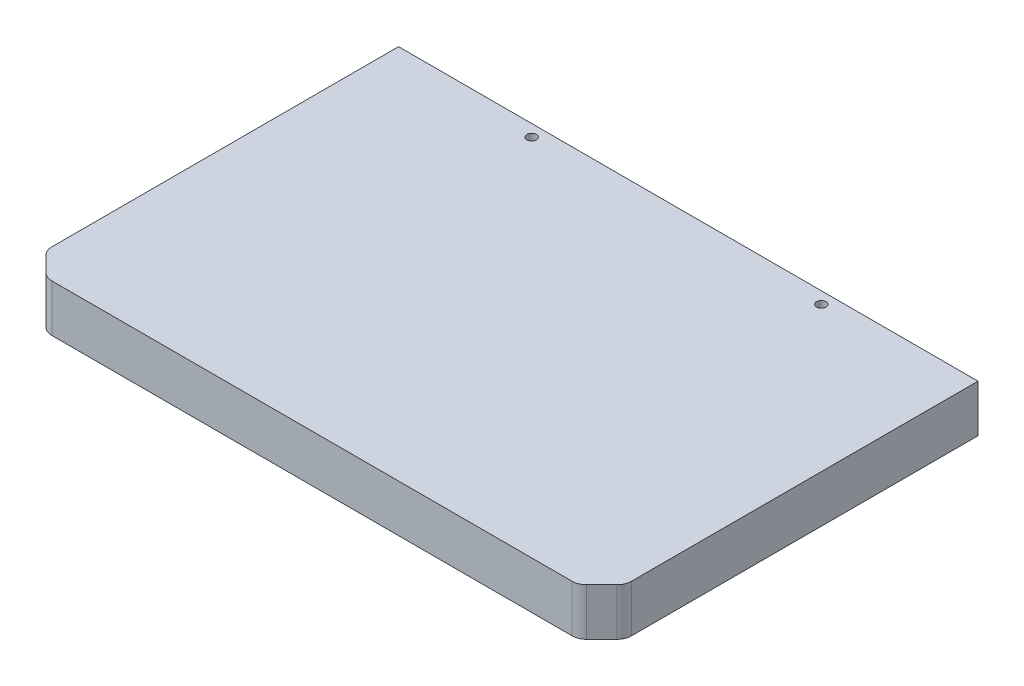
ISO-10303-21;
HEADER;
FILE_DESCRIPTION(('STEP AP214'),'2;1');
FILE_NAME('part.step','',(''),(''),'','','');
FILE_SCHEMA(('AUTOMOTIVE_DESIGN { 1 0 10303 214 1 1 1 1 }'));
ENDSEC;
DATA;
#1=APPLICATION_CONTEXT('core data for automotive mechanical design processes');
#2=APPLICATION_PROTOCOL_DEFINITION('international standard','automotive_design',2000,#1);
#3=PRODUCT_CONTEXT('',#1,'mechanical');
#4=PRODUCT('Part','Part','',(#3));
#5=PRODUCT_RELATED_PRODUCT_CATEGORY('part','',(#4));
#6=PRODUCT_DEFINITION_FORMATION('','',#4);
#7=PRODUCT_DEFINITION_CONTEXT('part definition',#1,'design');
#8=PRODUCT_DEFINITION('design','',#6,#7);
#9=PRODUCT_DEFINITION_SHAPE('','',#8);
#10=(LENGTH_UNIT() NAMED_UNIT(*) SI_UNIT(.MILLI.,.METRE.));
#11=(NAMED_UNIT(*) PLANE_ANGLE_UNIT() SI_UNIT($,.RADIAN.));
#12=(NAMED_UNIT(*) SI_UNIT($,.STERADIAN.) SOLID_ANGLE_UNIT());
#13=UNCERTAINTY_MEASURE_WITH_UNIT(LENGTH_MEASURE(1.E-05),#10,'distance_accuracy_value','');
#14=(GEOMETRIC_REPRESENTATION_CONTEXT(3) GLOBAL_UNCERTAINTY_ASSIGNED_CONTEXT((#13)) GLOBAL_UNIT_ASSIGNED_CONTEXT((#10,
#11,#12)) REPRESENTATION_CONTEXT('',''));
#15=CARTESIAN_POINT('',(0.,0.,0.));
#16=DIRECTION('',(0.,0.,1.));
#17=DIRECTION('',(1.,0.,0.));
#18=AXIS2_PLACEMENT_3D('',#15,#16,#17);
#19=CARTESIAN_POINT('',(-58.25,10.,29.0073593128807));
#20=DIRECTION('',(0.,-1.,0.));
#21=DIRECTION('',(0.,0.,-1.));
#22=AXIS2_PLACEMENT_3D('',#19,#20,#21);
#23=PLANE('',#22);
#24=DIRECTION('',(-1.,0.,0.));
#25=VECTOR('',#24,1.);
#26=CARTESIAN_POINT('',(61.25,10.,-44.29));
#27=LINE('',#26,#25);
#28=CARTESIAN_POINT('',(61.25,10.,-44.29));
#29=VERTEX_POINT('',#28);
#30=CARTESIAN_POINT('',(-61.25,10.,-44.29));
#31=VERTEX_POINT('',#30);
#32=EDGE_CURVE('E182',#29,#31,#27,.T.);
#33=ORIENTED_EDGE('',*,*,#32,.T.);
#34=DIRECTION('',(0.,0.,1.));
#35=VECTOR('',#34,1.);
#36=CARTESIAN_POINT('',(-61.25,10.,-44.29));
#37=LINE('',#36,#35);
#38=CARTESIAN_POINT('',(-61.25,10.,29.0073593128807));
#39=VERTEX_POINT('',#38);
#40=EDGE_CURVE('E106',#31,#39,#37,.T.);
#41=ORIENTED_EDGE('',*,*,#40,.T.);
#42=CARTESIAN_POINT('',(-58.25,10.,29.0073593128807));
#43=DIRECTION('',(0.,1.,0.));
#44=DIRECTION('',(0.,0.,-1.));
#45=AXIS2_PLACEMENT_3D('',#42,#43,#44);
#46=CIRCLE('',#45,3.);
#47=CARTESIAN_POINT('',(-60.3713203435596,10.,31.1286796564404));
#48=VERTEX_POINT('',#47);
#49=EDGE_CURVE('E211',#39,#48,#46,.T.);
#50=ORIENTED_EDGE('',*,*,#49,.T.);
#51=DIRECTION('',(0.707106781186547,0.,0.707106781186548));
#52=VECTOR('',#51,1.);
#53=CARTESIAN_POINT('',(-60.3713203435596,10.,31.1286796564404));
#54=LINE('',#53,#52);
#55=CARTESIAN_POINT('',(-57.1286796564404,10.,34.3713203435596));
#56=VERTEX_POINT('',#55);
#57=EDGE_CURVE('E231',#48,#56,#54,.T.);
#58=ORIENTED_EDGE('',*,*,#57,.T.);
#59=CARTESIAN_POINT('',(-55.0073593128807,10.,32.25));
#60=DIRECTION('',(0.,1.,0.));
#61=DIRECTION('',(0.,0.,1.));
#62=AXIS2_PLACEMENT_3D('',#59,#60,#61);
#63=CIRCLE('',#62,3.);
#64=CARTESIAN_POINT('',(-55.0073593128807,10.,35.25));
#65=VERTEX_POINT('',#64);
#66=EDGE_CURVE('E227',#56,#65,#63,.T.);
#67=ORIENTED_EDGE('',*,*,#66,.T.);
#68=DIRECTION('',(1.,0.,0.));
#69=VECTOR('',#68,1.);
#70=CARTESIAN_POINT('',(-55.0073593128807,10.,35.25));
#71=LINE('',#70,#69);
#72=CARTESIAN_POINT('',(55.0073593128807,10.,35.25));
#73=VERTEX_POINT('',#72);
#74=EDGE_CURVE('E230',#65,#73,#71,.T.);
#75=ORIENTED_EDGE('',*,*,#74,.T.);
#76=CARTESIAN_POINT('',(55.0073593128807,10.,32.25));
#77=DIRECTION('',(0.,1.,0.));
#78=DIRECTION('',(0.,0.,-1.));
#79=AXIS2_PLACEMENT_3D('',#76,#77,#78);
#80=CIRCLE('',#79,3.);
#81=CARTESIAN_POINT('',(57.1286796564404,10.,34.3713203435596));
#82=VERTEX_POINT('',#81);
#83=EDGE_CURVE('E131',#73,#82,#80,.T.);
#84=ORIENTED_EDGE('',*,*,#83,.T.);
#85=DIRECTION('',(0.707106781186548,0.,-0.707106781186547));
#86=VECTOR('',#85,1.);
#87=CARTESIAN_POINT('',(57.1286796564404,10.,34.3713203435596));
#88=LINE('',#87,#86);
#89=CARTESIAN_POINT('',(60.3713203435596,10.,31.1286796564404));
#90=VERTEX_POINT('',#89);
#91=EDGE_CURVE('E125',#82,#90,#88,.T.);
#92=ORIENTED_EDGE('',*,*,#91,.T.);
#93=CARTESIAN_POINT('',(58.25,10.,29.0073593128807));
#94=DIRECTION('',(0.,1.,0.));
#95=DIRECTION('',(0.,0.,1.));
#96=AXIS2_PLACEMENT_3D('',#93,#94,#95);
#97=CIRCLE('',#96,3.);
#98=CARTESIAN_POINT('',(61.25,10.,29.0073593128807));
#99=VERTEX_POINT('',#98);
#100=EDGE_CURVE('E129',#90,#99,#97,.T.);
#101=ORIENTED_EDGE('',*,*,#100,.T.);
#102=DIRECTION('',(0.,0.,-1.));
#103=VECTOR('',#102,1.);
#104=CARTESIAN_POINT('',(61.25,10.,29.0073593128807));
#105=LINE('',#104,#103);
#106=EDGE_CURVE('E57',#99,#29,#105,.T.);
#107=ORIENTED_EDGE('',*,*,#106,.T.);
#108=EDGE_LOOP('',(#33,#41,#50,#58,#67,#75,#84,#92,#101,#107));
#109=FACE_BOUND('',#108,.T.);
#110=CARTESIAN_POINT('',(-30.625,10.,-41.79));
#111=DIRECTION('',(0.,1.,0.));
#112=DIRECTION('',(0.,0.,1.));
#113=AXIS2_PLACEMENT_3D('',#110,#111,#112);
#114=CIRCLE('',#113,0.999999999999998);
#115=CARTESIAN_POINT('',(-30.625,10.,-40.79));
#116=VERTEX_POINT('',#115);
#117=EDGE_CURVE('E158',#116,#116,#114,.T.);
#118=ORIENTED_EDGE('',*,*,#117,.F.);
#119=EDGE_LOOP('',(#118));
#120=FACE_BOUND('',#119,.T.);
#121=CARTESIAN_POINT('',(30.625,10.,-41.79));
#122=DIRECTION('',(0.,1.,0.));
#123=DIRECTION('',(0.,0.,1.));
#124=AXIS2_PLACEMENT_3D('',#121,#122,#123);
#125=CIRCLE('',#124,0.999999999999998);
#126=CARTESIAN_POINT('',(30.625,10.,-40.79));
#127=VERTEX_POINT('',#126);
#128=EDGE_CURVE('E249',#127,#127,#125,.T.);
#129=ORIENTED_EDGE('',*,*,#128,.F.);
#130=EDGE_LOOP('',(#129));
#131=FACE_BOUND('',#130,.T.);
#132=ADVANCED_FACE('F39',(#109,#120,#131),#23,.F.);
#133=CARTESIAN_POINT('',(-58.25,0.,29.0073593128807));
#134=DIRECTION('',(0.,-1.,0.));
#135=DIRECTION('',(0.,0.,-1.));
#136=AXIS2_PLACEMENT_3D('',#133,#134,#135);
#137=PLANE('',#136);
#138=CARTESIAN_POINT('',(-30.625,0.,-41.79));
#139=DIRECTION('',(0.,1.,0.));
#140=DIRECTION('',(0.,0.,1.));
#141=AXIS2_PLACEMENT_3D('',#138,#139,#140);
#142=CIRCLE('',#141,0.999999999999998);
#143=CARTESIAN_POINT('',(-30.625,0.,-40.79));
#144=VERTEX_POINT('',#143);
#145=EDGE_CURVE('E245',#144,#144,#142,.T.);
#146=ORIENTED_EDGE('',*,*,#145,.T.);
#147=EDGE_LOOP('',(#146));
#148=FACE_BOUND('',#147,.T.);
#149=DIRECTION('',(-1.,0.,0.));
#150=VECTOR('',#149,1.);
#151=CARTESIAN_POINT('',(61.25,0.,-44.29));
#152=LINE('',#151,#150);
#153=CARTESIAN_POINT('',(61.25,0.,-44.29));
#154=VERTEX_POINT('',#153);
#155=CARTESIAN_POINT('',(-61.25,0.,-44.29));
#156=VERTEX_POINT('',#155);
#157=EDGE_CURVE('E153',#154,#156,#152,.T.);
#158=ORIENTED_EDGE('',*,*,#157,.F.);
#159=DIRECTION('',(0.,0.,-1.));
#160=VECTOR('',#159,1.);
#161=CARTESIAN_POINT('',(61.25,0.,29.0073593128807));
#162=LINE('',#161,#160);
#163=CARTESIAN_POINT('',(61.25,0.,29.0073593128807));
#164=VERTEX_POINT('',#163);
#165=EDGE_CURVE('E98',#164,#154,#162,.T.);
#166=ORIENTED_EDGE('',*,*,#165,.F.);
#167=CARTESIAN_POINT('',(58.25,0.,29.0073593128807));
#168=DIRECTION('',(0.,1.,0.));
#169=DIRECTION('',(0.,0.,1.));
#170=AXIS2_PLACEMENT_3D('',#167,#168,#169);
#171=CIRCLE('',#170,3.);
#172=CARTESIAN_POINT('',(60.3713203435596,0.,31.1286796564404));
#173=VERTEX_POINT('',#172);
#174=EDGE_CURVE('E92',#173,#164,#171,.T.);
#175=ORIENTED_EDGE('',*,*,#174,.F.);
#176=DIRECTION('',(0.707106781186548,0.,-0.707106781186547));
#177=VECTOR('',#176,1.);
#178=CARTESIAN_POINT('',(57.1286796564404,0.,34.3713203435596));
#179=LINE('',#178,#177);
#180=CARTESIAN_POINT('',(57.1286796564404,0.,34.3713203435596));
#181=VERTEX_POINT('',#180);
#182=EDGE_CURVE('E140',#181,#173,#179,.T.);
#183=ORIENTED_EDGE('',*,*,#182,.F.);
#184=CARTESIAN_POINT('',(55.0073593128807,0.,32.25));
#185=DIRECTION('',(0.,1.,0.));
#186=DIRECTION('',(0.,0.,-1.));
#187=AXIS2_PLACEMENT_3D('',#184,#185,#186);
#188=CIRCLE('',#187,3.);
#189=CARTESIAN_POINT('',(55.0073593128807,0.,35.25));
#190=VERTEX_POINT('',#189);
#191=EDGE_CURVE('E173',#190,#181,#188,.T.);
#192=ORIENTED_EDGE('',*,*,#191,.F.);
#193=DIRECTION('',(1.,0.,0.));
#194=VECTOR('',#193,1.);
#195=CARTESIAN_POINT('',(-55.0073593128807,0.,35.25));
#196=LINE('',#195,#194);
#197=CARTESIAN_POINT('',(-55.0073593128807,0.,35.25));
#198=VERTEX_POINT('',#197);
#199=EDGE_CURVE('E170',#198,#190,#196,.T.);
#200=ORIENTED_EDGE('',*,*,#199,.F.);
#201=CARTESIAN_POINT('',(-55.0073593128807,0.,32.25));
#202=DIRECTION('',(0.,1.,0.));
#203=DIRECTION('',(0.,0.,1.));
#204=AXIS2_PLACEMENT_3D('',#201,#202,#203);
#205=CIRCLE('',#204,3.);
#206=CARTESIAN_POINT('',(-57.1286796564404,0.,34.3713203435596));
#207=VERTEX_POINT('',#206);
#208=EDGE_CURVE('E167',#207,#198,#205,.T.);
#209=ORIENTED_EDGE('',*,*,#208,.F.);
#210=DIRECTION('',(0.707106781186547,0.,0.707106781186548));
#211=VECTOR('',#210,1.);
#212=CARTESIAN_POINT('',(-60.3713203435596,0.,31.1286796564404));
#213=LINE('',#212,#211);
#214=CARTESIAN_POINT('',(-60.3713203435596,0.,31.1286796564404));
#215=VERTEX_POINT('',#214);
#216=EDGE_CURVE('E164',#215,#207,#213,.T.);
#217=ORIENTED_EDGE('',*,*,#216,.F.);
#218=CARTESIAN_POINT('',(-58.25,0.,29.0073593128807));
#219=DIRECTION('',(0.,1.,0.));
#220=DIRECTION('',(0.,0.,-1.));
#221=AXIS2_PLACEMENT_3D('',#218,#219,#220);
#222=CIRCLE('',#221,3.);
#223=CARTESIAN_POINT('',(-61.25,0.,29.0073593128807));
#224=VERTEX_POINT('',#223);
#225=EDGE_CURVE('E161',#224,#215,#222,.T.);
#226=ORIENTED_EDGE('',*,*,#225,.F.);
#227=DIRECTION('',(0.,0.,1.));
#228=VECTOR('',#227,1.);
#229=CARTESIAN_POINT('',(-61.25,0.,-44.29));
#230=LINE('',#229,#228);
#231=EDGE_CURVE('E157',#156,#224,#230,.T.);
#232=ORIENTED_EDGE('',*,*,#231,.F.);
#233=EDGE_LOOP('',(#158,#166,#175,#183,#192,#200,#209,#217,#226,#232));
#234=FACE_BOUND('',#233,.T.);
#235=CARTESIAN_POINT('',(30.625,0.,-41.79));
#236=DIRECTION('',(0.,1.,0.));
#237=DIRECTION('',(0.,0.,1.));
#238=AXIS2_PLACEMENT_3D('',#235,#236,#237);
#239=CIRCLE('',#238,0.999999999999998);
#240=CARTESIAN_POINT('',(30.625,0.,-40.79));
#241=VERTEX_POINT('',#240);
#242=EDGE_CURVE('E253',#241,#241,#239,.T.);
#243=ORIENTED_EDGE('',*,*,#242,.T.);
#244=EDGE_LOOP('',(#243));
#245=FACE_BOUND('',#244,.T.);
#246=ADVANCED_FACE('F215',(#148,#234,#245),#137,.T.);
#247=CARTESIAN_POINT('',(61.25,10.,-44.29));
#248=DIRECTION('',(0.,0.,1.));
#249=DIRECTION('',(1.,0.,0.));
#250=AXIS2_PLACEMENT_3D('',#247,#248,#249);
#251=PLANE('',#250);
#252=ORIENTED_EDGE('',*,*,#157,.T.);
#253=DIRECTION('',(0.,-1.,0.));
#254=VECTOR('',#253,1.);
#255=CARTESIAN_POINT('',(-61.25,10.,-44.29));
#256=LINE('',#255,#254);
#257=EDGE_CURVE('E11',#31,#156,#256,.T.);
#258=ORIENTED_EDGE('',*,*,#257,.F.);
#259=ORIENTED_EDGE('',*,*,#32,.F.);
#260=DIRECTION('',(0.,-1.,0.));
#261=VECTOR('',#260,1.);
#262=CARTESIAN_POINT('',(61.25,10.,-44.29));
#263=LINE('',#262,#261);
#264=EDGE_CURVE('E149',#29,#154,#263,.T.);
#265=ORIENTED_EDGE('',*,*,#264,.T.);
#266=EDGE_LOOP('',(#252,#258,#259,#265));
#267=FACE_BOUND('',#266,.T.);
#268=ADVANCED_FACE('F41',(#267),#251,.F.);
#269=CARTESIAN_POINT('',(-61.25,10.,-44.29));
#270=DIRECTION('',(1.,0.,0.));
#271=DIRECTION('',(0.,0.,-1.));
#272=AXIS2_PLACEMENT_3D('',#269,#270,#271);
#273=PLANE('',#272);
#274=ORIENTED_EDGE('',*,*,#231,.T.);
#275=DIRECTION('',(0.,-1.,0.));
#276=VECTOR('',#275,1.);
#277=CARTESIAN_POINT('',(-61.25,10.,29.0073593128807));
#278=LINE('',#277,#276);
#279=EDGE_CURVE('E49',#39,#224,#278,.T.);
#280=ORIENTED_EDGE('',*,*,#279,.F.);
#281=ORIENTED_EDGE('',*,*,#40,.F.);
#282=ORIENTED_EDGE('',*,*,#257,.T.);
#283=EDGE_LOOP('',(#274,#280,#281,#282));
#284=FACE_BOUND('',#283,.T.);
#285=ADVANCED_FACE('F295',(#284),#273,.F.);
#286=CARTESIAN_POINT('',(-58.25,10.,29.0073593128807));
#287=DIRECTION('',(0.,-1.,0.));
#288=DIRECTION('',(0.,0.,-1.));
#289=AXIS2_PLACEMENT_3D('',#286,#287,#288);
#290=CYLINDRICAL_SURFACE('',#289,3.);
#291=ORIENTED_EDGE('',*,*,#225,.T.);
#292=DIRECTION('',(0.,-1.,0.));
#293=VECTOR('',#292,1.);
#294=CARTESIAN_POINT('',(-60.3713203435596,10.,31.1286796564404));
#295=LINE('',#294,#293);
#296=EDGE_CURVE('E201',#48,#215,#295,.T.);
#297=ORIENTED_EDGE('',*,*,#296,.F.);
#298=ORIENTED_EDGE('',*,*,#49,.F.);
#299=ORIENTED_EDGE('',*,*,#279,.T.);
#300=EDGE_LOOP('',(#291,#297,#298,#299));
#301=FACE_BOUND('',#300,.T.);
#302=ADVANCED_FACE('F209',(#301),#290,.T.);
#303=CARTESIAN_POINT('',(-60.3713203435596,10.,31.1286796564404));
#304=DIRECTION('',(0.707106781186548,0.,-0.707106781186547));
#305=DIRECTION('',(-0.707106781186547,0.,-0.707106781186548));
#306=AXIS2_PLACEMENT_3D('',#303,#304,#305);
#307=PLANE('',#306);
#308=ORIENTED_EDGE('',*,*,#216,.T.);
#309=DIRECTION('',(0.,-1.,0.));
#310=VECTOR('',#309,1.);
#311=CARTESIAN_POINT('',(-57.1286796564404,10.,34.3713203435596));
#312=LINE('',#311,#310);
#313=EDGE_CURVE('E197',#56,#207,#312,.T.);
#314=ORIENTED_EDGE('',*,*,#313,.F.);
#315=ORIENTED_EDGE('',*,*,#57,.F.);
#316=ORIENTED_EDGE('',*,*,#296,.T.);
#317=EDGE_LOOP('',(#308,#314,#315,#316));
#318=FACE_BOUND('',#317,.T.);
#319=ADVANCED_FACE('F221',(#318),#307,.F.);
#320=CARTESIAN_POINT('',(-55.0073593128807,10.,32.25));
#321=DIRECTION('',(0.,-1.,0.));
#322=DIRECTION('',(0.,0.,-1.));
#323=AXIS2_PLACEMENT_3D('',#320,#321,#322);
#324=CYLINDRICAL_SURFACE('',#323,3.);
#325=ORIENTED_EDGE('',*,*,#208,.T.);
#326=DIRECTION('',(0.,-1.,0.));
#327=VECTOR('',#326,1.);
#328=CARTESIAN_POINT('',(-55.0073593128807,10.,35.25));
#329=LINE('',#328,#327);
#330=EDGE_CURVE('E193',#65,#198,#329,.T.);
#331=ORIENTED_EDGE('',*,*,#330,.F.);
#332=ORIENTED_EDGE('',*,*,#66,.F.);
#333=ORIENTED_EDGE('',*,*,#313,.T.);
#334=EDGE_LOOP('',(#325,#331,#332,#333));
#335=FACE_BOUND('',#334,.T.);
#336=ADVANCED_FACE('F225',(#335),#324,.T.);
#337=CARTESIAN_POINT('',(-55.0073593128807,10.,35.25));
#338=DIRECTION('',(0.,0.,-1.));
#339=DIRECTION('',(-1.,0.,0.));
#340=AXIS2_PLACEMENT_3D('',#337,#338,#339);
#341=PLANE('',#340);
#342=ORIENTED_EDGE('',*,*,#199,.T.);
#343=DIRECTION('',(0.,-1.,0.));
#344=VECTOR('',#343,1.);
#345=CARTESIAN_POINT('',(55.0073593128807,10.,35.25));
#346=LINE('',#345,#344);
#347=EDGE_CURVE('E189',#73,#190,#346,.T.);
#348=ORIENTED_EDGE('',*,*,#347,.F.);
#349=ORIENTED_EDGE('',*,*,#74,.F.);
#350=ORIENTED_EDGE('',*,*,#330,.T.);
#351=EDGE_LOOP('',(#342,#348,#349,#350));
#352=FACE_BOUND('',#351,.T.);
#353=ADVANCED_FACE('F285',(#352),#341,.F.);
#354=CARTESIAN_POINT('',(55.0073593128807,10.,32.25));
#355=DIRECTION('',(0.,-1.,0.));
#356=DIRECTION('',(0.,0.,-1.));
#357=AXIS2_PLACEMENT_3D('',#354,#355,#356);
#358=CYLINDRICAL_SURFACE('',#357,3.);
#359=ORIENTED_EDGE('',*,*,#191,.T.);
#360=DIRECTION('',(0.,-1.,0.));
#361=VECTOR('',#360,1.);
#362=CARTESIAN_POINT('',(57.1286796564404,10.,34.3713203435596));
#363=LINE('',#362,#361);
#364=EDGE_CURVE('E142',#82,#181,#363,.T.);
#365=ORIENTED_EDGE('',*,*,#364,.F.);
#366=ORIENTED_EDGE('',*,*,#83,.F.);
#367=ORIENTED_EDGE('',*,*,#347,.T.);
#368=EDGE_LOOP('',(#359,#365,#366,#367));
#369=FACE_BOUND('',#368,.T.);
#370=ADVANCED_FACE('F282',(#369),#358,.T.);
#371=CARTESIAN_POINT('',(57.1286796564404,10.,34.3713203435596));
#372=DIRECTION('',(-0.707106781186547,0.,-0.707106781186548));
#373=DIRECTION('',(-0.707106781186548,0.,0.707106781186547));
#374=AXIS2_PLACEMENT_3D('',#371,#372,#373);
#375=PLANE('',#374);
#376=ORIENTED_EDGE('',*,*,#182,.T.);
#377=DIRECTION('',(0.,-1.,0.));
#378=VECTOR('',#377,1.);
#379=CARTESIAN_POINT('',(60.3713203435596,10.,31.1286796564404));
#380=LINE('',#379,#378);
#381=EDGE_CURVE('E137',#90,#173,#380,.T.);
#382=ORIENTED_EDGE('',*,*,#381,.F.);
#383=ORIENTED_EDGE('',*,*,#91,.F.);
#384=ORIENTED_EDGE('',*,*,#364,.T.);
#385=EDGE_LOOP('',(#376,#382,#383,#384));
#386=FACE_BOUND('',#385,.T.);
#387=ADVANCED_FACE('F138',(#386),#375,.F.);
#388=CARTESIAN_POINT('',(58.25,10.,29.0073593128807));
#389=DIRECTION('',(0.,-1.,0.));
#390=DIRECTION('',(0.,0.,-1.));
#391=AXIS2_PLACEMENT_3D('',#388,#389,#390);
#392=CYLINDRICAL_SURFACE('',#391,3.);
#393=ORIENTED_EDGE('',*,*,#174,.T.);
#394=DIRECTION('',(0.,-1.,0.));
#395=VECTOR('',#394,1.);
#396=CARTESIAN_POINT('',(61.25,10.,29.0073593128807));
#397=LINE('',#396,#395);
#398=EDGE_CURVE('E143',#99,#164,#397,.T.);
#399=ORIENTED_EDGE('',*,*,#398,.F.);
#400=ORIENTED_EDGE('',*,*,#100,.F.);
#401=ORIENTED_EDGE('',*,*,#381,.T.);
#402=EDGE_LOOP('',(#393,#399,#400,#401));
#403=FACE_BOUND('',#402,.T.);
#404=ADVANCED_FACE('F145',(#403),#392,.T.);
#405=CARTESIAN_POINT('',(61.25,10.,29.0073593128807));
#406=DIRECTION('',(-1.,0.,0.));
#407=DIRECTION('',(0.,0.,1.));
#408=AXIS2_PLACEMENT_3D('',#405,#406,#407);
#409=PLANE('',#408);
#410=ORIENTED_EDGE('',*,*,#165,.T.);
#411=ORIENTED_EDGE('',*,*,#264,.F.);
#412=ORIENTED_EDGE('',*,*,#106,.F.);
#413=ORIENTED_EDGE('',*,*,#398,.T.);
#414=EDGE_LOOP('',(#410,#411,#412,#413));
#415=FACE_BOUND('',#414,.T.);
#416=ADVANCED_FACE('F275',(#415),#409,.F.);
#417=CARTESIAN_POINT('',(-30.625,10.,-41.79));
#418=DIRECTION('',(0.,-1.,0.));
#419=DIRECTION('',(0.,0.,-1.));
#420=AXIS2_PLACEMENT_3D('',#417,#418,#419);
#421=CYLINDRICAL_SURFACE('',#420,0.999999999999998);
#422=ORIENTED_EDGE('',*,*,#117,.T.);
#423=EDGE_LOOP('',(#422));
#424=FACE_BOUND('',#423,.T.);
#425=ORIENTED_EDGE('',*,*,#145,.F.);
#426=EDGE_LOOP('',(#425));
#427=FACE_BOUND('',#426,.T.);
#428=ADVANCED_FACE('F272',(#424,#427),#421,.F.);
#429=CARTESIAN_POINT('',(30.625,10.,-41.79));
#430=DIRECTION('',(0.,-1.,0.));
#431=DIRECTION('',(0.,0.,-1.));
#432=AXIS2_PLACEMENT_3D('',#429,#430,#431);
#433=CYLINDRICAL_SURFACE('',#432,0.999999999999998);
#434=ORIENTED_EDGE('',*,*,#128,.T.);
#435=EDGE_LOOP('',(#434));
#436=FACE_BOUND('',#435,.T.);
#437=ORIENTED_EDGE('',*,*,#242,.F.);
#438=EDGE_LOOP('',(#437));
#439=FACE_BOUND('',#438,.T.);
#440=ADVANCED_FACE('F261',(#436,#439),#433,.F.);
#441=CLOSED_SHELL('',(#132,#246,#268,#285,#302,#319,#336,#353,#370,#387,#404,#416,#428,#440));
#442=MANIFOLD_SOLID_BREP('B2',#441);
#443=ADVANCED_BREP_SHAPE_REPRESENTATION('',(#18,#442),#14);
#444=SHAPE_DEFINITION_REPRESENTATION(#9,#443);
ENDSEC;
END-ISO-10303-21;
